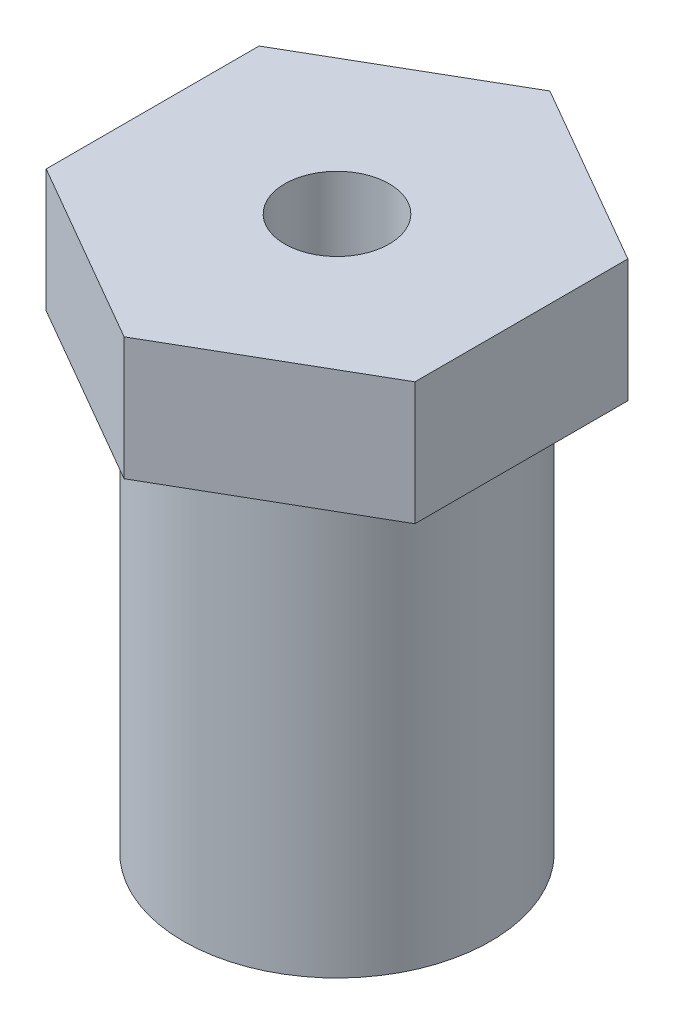
ISO-10303-21;
HEADER;
FILE_DESCRIPTION(('STEP AP214'),'2;1');
FILE_NAME('part.step','',(''),(''),'','','');
FILE_SCHEMA(('AUTOMOTIVE_DESIGN { 1 0 10303 214 1 1 1 1 }'));
ENDSEC;
DATA;
#1=APPLICATION_CONTEXT('core data for automotive mechanical design processes');
#2=APPLICATION_PROTOCOL_DEFINITION('international standard','automotive_design',2000,#1);
#3=PRODUCT_CONTEXT('',#1,'mechanical');
#4=PRODUCT('Part','Part','',(#3));
#5=PRODUCT_RELATED_PRODUCT_CATEGORY('part','',(#4));
#6=PRODUCT_DEFINITION_FORMATION('','',#4);
#7=PRODUCT_DEFINITION_CONTEXT('part definition',#1,'design');
#8=PRODUCT_DEFINITION('design','',#6,#7);
#9=PRODUCT_DEFINITION_SHAPE('','',#8);
#10=(LENGTH_UNIT() NAMED_UNIT(*) SI_UNIT(.MILLI.,.METRE.));
#11=(NAMED_UNIT(*) PLANE_ANGLE_UNIT() SI_UNIT($,.RADIAN.));
#12=(NAMED_UNIT(*) SI_UNIT($,.STERADIAN.) SOLID_ANGLE_UNIT());
#13=UNCERTAINTY_MEASURE_WITH_UNIT(LENGTH_MEASURE(1.E-05),#10,'distance_accuracy_value','');
#14=(GEOMETRIC_REPRESENTATION_CONTEXT(3) GLOBAL_UNCERTAINTY_ASSIGNED_CONTEXT((#13)) GLOBAL_UNIT_ASSIGNED_CONTEXT((#10,
#11,#12)) REPRESENTATION_CONTEXT('',''));
#15=CARTESIAN_POINT('',(0.,0.,0.));
#16=DIRECTION('',(0.,0.,1.));
#17=DIRECTION('',(1.,0.,0.));
#18=AXIS2_PLACEMENT_3D('',#15,#16,#17);
#19=CARTESIAN_POINT('',(-3.,6.,-5.19615242270664));
#20=DIRECTION('',(-0.5,0.,-0.866025403784438));
#21=DIRECTION('',(-0.866025403784439,0.,0.5));
#22=AXIS2_PLACEMENT_3D('',#19,#20,#21);
#23=CYLINDRICAL_SURFACE('',#22,1.69999999999999);
#24=CARTESIAN_POINT('',(0.,6.79999999999998,-3.));
#25=CARTESIAN_POINT('',(-0.05408169265973,6.88781961083474,-2.99999842011512));
#26=CARTESIAN_POINT('',(-0.11584986274738,6.97092265030721,-2.99853255813965));
#27=CARTESIAN_POINT('',(-0.251580183169669,7.12625088742073,-2.99020647210895));
#28=CARTESIAN_POINT('',(-0.325555140778262,7.19846450602118,-2.98334055355004));
#29=CARTESIAN_POINT('',(-0.482982376331943,7.33058608028531,-2.96193211334839));
#30=CARTESIAN_POINT('',(-0.56644430771567,7.39048132419887,-2.94738171651048));
#31=CARTESIAN_POINT('',(-0.739897877773428,7.49601278090847,-2.90868096501998));
#32=CARTESIAN_POINT('',(-0.829883890136409,7.5416611040453,-2.88453880357756));
#33=CARTESIAN_POINT('',(-1.00887962701823,7.6149604397967,-2.82676304946186));
#34=CARTESIAN_POINT('',(-1.09774410608916,7.64334225341772,-2.79361673714729));
#35=CARTESIAN_POINT('',(-1.27489957816332,7.68367031629994,-2.71733254736103));
#36=CARTESIAN_POINT('',(-1.36319104222212,7.6956324155236,-2.67420435248285));
#37=CARTESIAN_POINT('',(-1.5248859990315,7.7019614399458,-2.58499256321337));
#38=CARTESIAN_POINT('',(-1.59878255194164,7.69831671712663,-2.53992971618292));
#39=CARTESIAN_POINT('',(-1.74116848270436,7.67804128946428,-2.44451880767874));
#40=CARTESIAN_POINT('',(-1.80965816352961,7.66141131281595,-2.39417104271284));
#41=CARTESIAN_POINT('',(-1.93804307206996,7.61653585479174,-2.29141739960441));
#42=CARTESIAN_POINT('',(-1.99810829551771,7.58858622480206,-2.23909263634188));
#43=CARTESIAN_POINT('',(-2.11081351753923,7.52217046659896,-2.13317926024697));
#44=CARTESIAN_POINT('',(-2.16345193033774,7.48370209755677,-2.0795903803424));
#45=CARTESIAN_POINT('',(-2.26567953207534,7.39325492628011,-1.9679818983662));
#46=CARTESIAN_POINT('',(-2.31450655739578,7.340341035683,-1.91002388404943));
#47=CARTESIAN_POINT('',(-2.40314245716176,7.22447784736072,-1.79723761210463));
#48=CARTESIAN_POINT('',(-2.44294174111377,7.16151799724178,-1.74241272872222));
#49=CARTESIAN_POINT('',(-2.51798674739819,7.01879947622295,-1.63238218969293));
#50=CARTESIAN_POINT('',(-2.55216808185899,6.93793922894885,-1.57787065692512));
#51=CARTESIAN_POINT('',(-2.61024937587533,6.76646107669214,-1.47981572008613));
#52=CARTESIAN_POINT('',(-2.63415947316876,6.67585290393186,-1.43626151877994));
#53=CARTESIAN_POINT('',(-2.6684041815498,6.50521626410009,-1.37138485768083));
#54=CARTESIAN_POINT('',(-2.68047452737696,6.42655677976909,-1.34738620379777));
#55=CARTESIAN_POINT('',(-2.6982723487657,6.26587538127644,-1.31138832935055));
#56=CARTESIAN_POINT('',(-2.70400741191225,6.1838576116568,-1.29937475627676));
#57=CARTESIAN_POINT('',(-2.7091706920176,6.0184960092893,-1.28857865215158));
#58=CARTESIAN_POINT('',(-2.70858019415916,5.93514897049141,-1.28983538248938));
#59=CARTESIAN_POINT('',(-2.70104647521384,5.76998520070034,-1.30553343364534));
#60=CARTESIAN_POINT('',(-2.69410005791733,5.68816926077823,-1.31998138794386));
#61=CARTESIAN_POINT('',(-2.67421401115099,5.53134855143156,-1.35979577621028));
#62=CARTESIAN_POINT('',(-2.66150650325925,5.45620367579721,-1.3847368571845));
#63=CARTESIAN_POINT('',(-2.63010523926771,5.31081793839377,-1.44348611278553));
#64=CARTESIAN_POINT('',(-2.61140932149964,5.24057885866526,-1.47729748857125));
#65=CARTESIAN_POINT('',(-2.56480646862616,5.09648655712385,-1.55697753274693));
#66=CARTESIAN_POINT('',(-2.53597770764162,5.0234989025504,-1.60387068535018));
#67=CARTESIAN_POINT('',(-2.46992452567164,4.88600319753576,-1.70383892133012));
#68=CARTESIAN_POINT('',(-2.43269314476303,4.8215022471779,-1.75691911172994));
#69=CARTESIAN_POINT('',(-2.34377377735252,4.69388203930191,-1.87425823230111));
#70=CARTESIAN_POINT('',(-2.29081045598446,4.63213443732866,-1.93905728510565));
#71=CARTESIAN_POINT('',(-2.17321979261564,4.5226880254782,-2.069986734252));
#72=CARTESIAN_POINT('',(-2.10859568958922,4.4749853240572,-2.1361167563747));
#73=CARTESIAN_POINT('',(-1.97098953851385,4.39729840260364,-2.26354234621131));
#74=CARTESIAN_POINT('',(-1.8984553124316,4.36667144558871,-2.32492510802883));
#75=CARTESIAN_POINT('',(-1.74461579704232,4.32196888379412,-2.44246757305399));
#76=CARTESIAN_POINT('',(-1.66332054009747,4.30787456262987,-2.49863311612159));
#77=CARTESIAN_POINT('',(-1.50529060531348,4.29778908231391,-2.59646757662748));
#78=CARTESIAN_POINT('',(-1.42925746120449,4.29975398732385,-2.63907102471868));
#79=CARTESIAN_POINT('',(-1.27497936146063,4.31689698120534,-2.71696325524233));
#80=CARTESIAN_POINT('',(-1.1967345756648,4.33207405812473,-2.75225259762353));
#81=CARTESIAN_POINT('',(-1.04315970159673,4.37416835500948,-2.81397417775792));
#82=CARTESIAN_POINT('',(-0.967818867473064,4.40068032070097,-2.84066093632769));
#83=CARTESIAN_POINT('',(-0.819503870906033,4.46430590331753,-2.88694566956916));
#84=CARTESIAN_POINT('',(-0.746530173326471,4.5014215887577,-2.90654225943778));
#85=CARTESIAN_POINT('',(-0.598380708122485,4.58890626107131,-2.94078680808685));
#86=CARTESIAN_POINT('',(-0.523592864252902,4.64016439928516,-2.95483452376178));
#87=CARTESIAN_POINT('',(-0.380897858422043,4.75270872757631,-2.97659840220921));
#88=CARTESIAN_POINT('',(-0.31299769745678,4.81400495871614,-2.98430817819977));
#89=CARTESIAN_POINT('',(-0.178475553782575,4.95339298110832,-2.99553382772199));
#90=CARTESIAN_POINT('',(-0.11296805612401,5.03261553520194,-2.99844115570703));
#91=CARTESIAN_POINT('',(0.00395170643339162,5.2009106307356,-3.00056838201603));
#92=CARTESIAN_POINT('',(0.0553752348809439,5.28997522059763,-2.99979123613255));
#93=CARTESIAN_POINT('',(0.132870092929511,5.45905164296436,-2.99725987916219));
#94=CARTESIAN_POINT('',(0.161862463285092,5.53772397881135,-2.99571121709793));
#95=CARTESIAN_POINT('',(0.206280719317359,5.69878963935455,-2.99298401410815));
#96=CARTESIAN_POINT('',(0.221722993947297,5.78117834184618,-2.99180502717033));
#97=CARTESIAN_POINT('',(0.237833260595179,5.94772326187039,-2.99056976027155));
#98=CARTESIAN_POINT('',(0.238447907908849,6.03188477131879,-2.99051753407944));
#99=CARTESIAN_POINT('',(0.224707994913821,6.19897352067671,-2.99157964052133));
#100=CARTESIAN_POINT('',(0.210348528585427,6.28190034703134,-2.99269435548469));
#101=CARTESIAN_POINT('',(0.168941074284039,6.4400278492101,-2.99530546548334));
#102=CARTESIAN_POINT('',(0.142561406538309,6.51540759423706,-2.9967800597025));
#103=CARTESIAN_POINT('',(0.0789893740049566,6.66146584789714,-2.99912814947559));
#104=CARTESIAN_POINT('',(0.0417894041836181,6.73214100683732,-3.00000122079108));
#105=CARTESIAN_POINT('',(0.,6.79999999999998,-3.));
#106=B_SPLINE_CURVE_WITH_KNOTS('',3,(#24,#25,#26,#27,#28,#29,#30,#31,#32,#33,#34,#35,#36,#37,
#38,#39,#40,#41,#42,#43,#44,#45,#46,#47,#48,#49,#50,#51,#52,#53,#54,#55,#56,#57,#58,#59,#60,#61,
#62,#63,#64,#65,#66,#67,#68,#69,#70,#71,#72,#73,#74,#75,#76,#77,#78,#79,#80,#81,#82,#83,#84,#85,
#86,#87,#88,#89,#90,#91,#92,#93,#94,#95,#96,#97,#98,#99,#100,#101,#102,#103,#104,#105),
.UNSPECIFIED.,.T.,.F.,(4,2,2,2,2,2,2,2,2,2,2,2,2,2,2,2,2,2,2,2,2,2,2,2,2,2,2,2,2,2,2,2,2,2,2,2,
2,2,2,2,4),(0.,0.309103118637499,0.618532632506998,0.928279872558717,1.23776309584082,
1.53302093289259,1.82799355642621,2.08658144245674,2.3451548282823,2.59736634859509,
2.84963163996676,3.12581233294823,3.40228506265132,3.71084137226387,4.01909243233194,
4.26740108876914,4.51541202958213,4.76415693822371,5.01302700233424,5.25265587010564,
5.49237133565607,5.76557012074642,6.03899603344368,6.34947380416687,6.65986546695699,
6.9576104158414,7.25501796517906,7.51522377722609,7.77540966123482,8.02698283348582,
8.27860511479093,8.55275851048861,8.82718783481127,9.13428758585227,9.44114101420879,
9.69166512924072,9.94188581393857,10.1930065728861,10.4442096332381,10.6828881960336,
10.9217349207548),.UNSPECIFIED.);
#107=CARTESIAN_POINT('',(0.,6.79999999999998,-3.));
#108=VERTEX_POINT('',#107);
#109=EDGE_CURVE('E191',#108,#108,#106,.T.);
#110=ORIENTED_EDGE('',*,*,#109,.T.);
#111=EDGE_LOOP('',(#110));
#112=FACE_BOUND('',#111,.T.);
#113=CARTESIAN_POINT('',(-2.5,6.,-4.3301270189222));
#114=DIRECTION('',(-0.5,0.,-0.866025403784438));
#115=DIRECTION('',(-0.866025403784438,0.,0.5));
#116=AXIS2_PLACEMENT_3D('',#113,#114,#115);
#117=CIRCLE('',#116,1.69999999999999);
#118=CARTESIAN_POINT('',(-3.97224318643354,6.,-3.4801270189222));
#119=VERTEX_POINT('',#118);
#120=EDGE_CURVE('E359',#119,#119,#117,.F.);
#121=ORIENTED_EDGE('',*,*,#120,.F.);
#122=EDGE_LOOP('',(#121));
#123=FACE_BOUND('',#122,.T.);
#124=ADVANCED_FACE('F35',(#112,#123),#23,.F.);
#125=CARTESIAN_POINT('',(4.5006830127019,6.,7.79541164676185));
#126=DIRECTION('',(-0.5,0.,-0.866025403784438));
#127=DIRECTION('',(-0.866025403784439,0.,0.5));
#128=AXIS2_PLACEMENT_3D('',#125,#126,#127);
#129=CYLINDRICAL_SURFACE('',#128,2.5493621783471);
#130=CARTESIAN_POINT('',(-4.35843746343336,6.,-2.45031077158401));
#131=CARTESIAN_POINT('',(-4.35843474018136,6.13242592835763,-2.45032826808866));
#132=CARTESIAN_POINT('',(-4.35254571689391,6.26501521387592,-2.46088318635183));
#133=CARTESIAN_POINT('',(-4.3290047454725,6.5260879254046,-2.50204754187415));
#134=CARTESIAN_POINT('',(-4.31132906271113,6.65456251753066,-2.53269744201476));
#135=CARTESIAN_POINT('',(-4.26437981041503,6.90313592021332,-2.61096055717455));
#136=CARTESIAN_POINT('',(-4.23516979816396,7.02327645848354,-2.65848067025964));
#137=CARTESIAN_POINT('',(-4.1650929988781,7.25358987936444,-2.76697644766752));
#138=CARTESIAN_POINT('',(-4.12422519082727,7.36376188779507,-2.8279532904551));
#139=CARTESIAN_POINT('',(-4.02657949662629,7.58146147598714,-2.96552832104463));
#140=CARTESIAN_POINT('',(-3.96873595591368,7.68794766276453,-3.04301875519778));
#141=CARTESIAN_POINT('',(-3.83866690142188,7.8853238227186,-3.20553792859178));
#142=CARTESIAN_POINT('',(-3.76643400570172,7.97620574594729,-3.29057052459471));
#143=CARTESIAN_POINT('',(-3.60177665440593,8.14609788539377,-3.47031239521371));
#144=CARTESIAN_POINT('',(-3.508284851063,8.22381236694947,-3.56528057340904));
#145=CARTESIAN_POINT('',(-3.30526791451359,8.35605154263622,-3.75424801663677));
#146=CARTESIAN_POINT('',(-3.19575335964838,8.41059144475398,-3.84824787746577));
#147=CARTESIAN_POINT('',(-2.97137567063272,8.49075963192941,-4.02364117242568));
#148=CARTESIAN_POINT('',(-2.85749734597724,8.51821834491896,-4.10545336455949));
#149=CARTESIAN_POINT('',(-2.62093520639103,8.54948765515492,-4.26035662772273));
#150=CARTESIAN_POINT('',(-2.498257015185,8.55331322178932,-4.33345319050352));
#151=CARTESIAN_POINT('',(-2.25966278054755,8.53787982490927,-4.46213407461893));
#152=CARTESIAN_POINT('',(-2.14413709987689,8.52067515398633,-4.51870389883828));
#153=CARTESIAN_POINT('',(-1.91282113769791,8.46736669165771,-4.62137760300195));
#154=CARTESIAN_POINT('',(-1.79703083696716,8.43126148083563,-4.66748069652977));
#155=CARTESIAN_POINT('',(-1.56706760050104,8.34098207385927,-4.74967624045102));
#156=CARTESIAN_POINT('',(-1.45293699688411,8.28657271447384,-4.78562658432226));
#157=CARTESIAN_POINT('',(-1.23100702865721,8.1615751811913,-4.84746453339607));
#158=CARTESIAN_POINT('',(-1.12320991413972,8.09098130057776,-4.87334858048785));
#159=CARTESIAN_POINT('',(-0.906659690568706,7.92774404988494,-4.91847117400741));
#160=CARTESIAN_POINT('',(-0.798833314420978,7.83362392760335,-4.93681852560103));
#161=CARTESIAN_POINT('',(-0.597501973262954,7.62993839045092,-4.96521398389935));
#162=CARTESIAN_POINT('',(-0.50400880089441,7.52036039842528,-4.9752552863403));
#163=CARTESIAN_POINT('',(-0.329217340193053,7.27978167968964,-4.98997266328497));
#164=CARTESIAN_POINT('',(-0.249179896839478,7.14783108411252,-4.99423766575049));
#165=CARTESIAN_POINT('',(-0.114433323471274,6.87152113433902,-4.99914941394098));
#166=CARTESIAN_POINT('',(-0.0596969641099141,6.72717531942434,-4.9998000578353));
#167=CARTESIAN_POINT('',(0.0168055637891447,6.44229734119767,-5.00010827943268));
#168=CARTESIAN_POINT('',(0.0408618940561221,6.30238617850803,-4.99984124330395));
#169=CARTESIAN_POINT('',(0.061614730456127,6.02058812721735,-4.99963366800008));
#170=CARTESIAN_POINT('',(0.0583324240379804,5.87870285368028,-4.99969287597365));
#171=CARTESIAN_POINT('',(0.0267530582802505,5.61455469511559,-4.99994591571752));
#172=CARTESIAN_POINT('',(0.00140079561449291,5.49192426374894,-5.00012334064891));
#173=CARTESIAN_POINT('',(-0.068626119677459,5.25232668651963,-4.99965069481582));
#174=CARTESIAN_POINT('',(-0.113307363467762,5.13536148763809,-4.99900034163272));
#175=CARTESIAN_POINT('',(-0.222002207433863,4.90427155618175,-4.99537667042951));
#176=CARTESIAN_POINT('',(-0.286810425681824,4.7905248719053,-4.99229789073031));
#177=CARTESIAN_POINT('',(-0.431988936743663,4.57365709897623,-4.9818350277141));
#178=CARTESIAN_POINT('',(-0.51236724412999,4.47054152466295,-4.97444872318109));
#179=CARTESIAN_POINT('',(-0.69745418830475,4.26360365632202,-4.95210464042128));
#180=CARTESIAN_POINT('',(-0.803974279151221,4.16148785951105,-4.9362754701477));
#181=CARTESIAN_POINT('',(-1.02977465854472,3.97494960903647,-4.89415508221757));
#182=CARTESIAN_POINT('',(-1.14905979000597,3.89053390679263,-4.86785988350439));
#183=CARTESIAN_POINT('',(-1.40031760692858,3.73956011764782,-4.80171552553947));
#184=CARTESIAN_POINT('',(-1.53256632220991,3.67362531954706,-4.7614773776739));
#185=CARTESIAN_POINT('',(-1.80156631559727,3.56601410379657,-4.66633041008536));
#186=CARTESIAN_POINT('',(-1.93831336708179,3.52431556500349,-4.61143503545447));
#187=CARTESIAN_POINT('',(-2.19794552418598,3.47008458744953,-4.49304497853895));
#188=CARTESIAN_POINT('',(-2.32092533345073,3.45517894339486,-4.43084372234883));
#189=CARTESIAN_POINT('',(-2.56175475106549,3.44788273191579,-4.29609361061714));
#190=CARTESIAN_POINT('',(-2.6796062895383,3.45548361804209,-4.2235486928529));
#191=CARTESIAN_POINT('',(-2.89845805694549,3.49145075216617,-4.07616724358668));
#192=CARTESIAN_POINT('',(-3.00006048010486,3.51832113375102,-4.00184947660826));
#193=CARTESIAN_POINT('',(-3.19347436338754,3.58999420262173,-3.84927312756091));
#194=CARTESIAN_POINT('',(-3.28528446897587,3.63479936669591,-3.77101400249702));
#195=CARTESIAN_POINT('',(-3.46142306098998,3.74297774102967,-3.61017573080965));
#196=CARTESIAN_POINT('',(-3.54528232980237,3.80704495954281,-3.52755217311567));
#197=CARTESIAN_POINT('',(-3.70046397569924,3.95106352218964,-3.36441129880491));
#198=CARTESIAN_POINT('',(-3.77178062380621,4.03102208953492,-3.28389495890085));
#199=CARTESIAN_POINT('',(-3.90857223852594,4.2140842630159,-3.1201887506843));
#200=CARTESIAN_POINT('',(-3.97269093029188,4.31872287125662,-3.03757634063891));
#201=CARTESIAN_POINT('',(-4.08604752618703,4.54319552239309,-2.88329644292488));
#202=CARTESIAN_POINT('',(-4.13527135592535,4.66304378632809,-2.81163933852671));
#203=CARTESIAN_POINT('',(-4.22072311908496,4.92062689847625,-2.68175372708998));
#204=CARTESIAN_POINT('',(-4.25638926030063,5.05886672872528,-2.6241354492129));
#205=CARTESIAN_POINT('',(-4.29810199527818,5.27364798589101,-2.55480591124155));
#206=CARTESIAN_POINT('',(-4.31003639808117,5.34641017844248,-2.5345562184029));
#207=CARTESIAN_POINT('',(-4.33001368128678,5.49389018875048,-2.50027591637198));
#208=CARTESIAN_POINT('',(-4.33805924318102,5.5686066214101,-2.48624102242057));
#209=CARTESIAN_POINT('',(-4.3489138405607,5.70277321144238,-2.46719276618697));
#210=CARTESIAN_POINT('',(-4.35248405865753,5.76198058953385,-2.46087638550313));
#211=CARTESIAN_POINT('',(-4.35724656224872,5.88078092214493,-2.4524313099679));
#212=CARTESIAN_POINT('',(-4.35843868960479,5.94037390204194,-2.4503028936079));
#213=CARTESIAN_POINT('',(-4.35843746343336,6.,-2.45031077158401));
#214=B_SPLINE_CURVE_WITH_KNOTS('',3,(#130,#131,#132,#133,#134,#135,#136,#137,#138,#139,#140,
#141,#142,#143,#144,#145,#146,#147,#148,#149,#150,#151,#152,#153,#154,#155,#156,#157,#158,#159,
#160,#161,#162,#163,#164,#165,#166,#167,#168,#169,#170,#171,#172,#173,#174,#175,#176,#177,#178,
#179,#180,#181,#182,#183,#184,#185,#186,#187,#188,#189,#190,#191,#192,#193,#194,#195,#196,#197,
#198,#199,#200,#201,#202,#203,#204,#205,#206,#207,#208,#209,#210,#211,#212,#213),.UNSPECIFIED.,
.T.,.F.,(4,2,2,2,2,2,2,2,2,2,2,2,2,2,2,2,2,2,2,2,2,2,2,2,2,2,2,2,2,2,2,2,2,2,2,2,2,2,2,2,2,4),
(0.,0.397036179111605,0.794874288400811,1.19055012586621,1.58626062815893,2.01598646991388,
2.44593333743397,2.90631452459125,3.36639312482059,3.79265457690301,4.21864600451408,
4.60615226712096,4.99368763533404,5.38640514339148,5.77926133851125,6.21032683141178,
6.64174510174315,7.10248735089337,7.56273258224711,7.9861038316588,8.40914699881666,
8.78313490643325,9.15725044422007,9.54857222927018,9.94009598175743,10.3833465995609,
10.8267659819339,11.2837116564872,11.7402396057355,12.1538530676552,12.5673094874606,
12.9517283789422,13.3362003768881,13.7366435004784,14.1372690584275,14.5791196874475,
15.0213865336425,15.4803767371496,15.7094618606165,15.9383887957455,16.117146417492,
16.2959159258671),.UNSPECIFIED.);
#215=CARTESIAN_POINT('',(-2.50000000000001,8.5493621783471,-4.3301270189222));
#216=VERTEX_POINT('',#215);
#217=CARTESIAN_POINT('',(-2.5,3.4506378216529,-4.33012701892219));
#218=VERTEX_POINT('',#217);
#219=EDGE_CURVE('E198',#216,#218,#214,.T.);
#220=ORIENTED_EDGE('',*,*,#219,.T.);
#221=CARTESIAN_POINT('',(-2.5,6.,-4.3301270189222));
#222=DIRECTION('',(-0.5,0.,-0.866025403784438));
#223=DIRECTION('',(-0.866025403784438,0.,0.5));
#224=AXIS2_PLACEMENT_3D('',#221,#222,#223);
#225=CIRCLE('',#224,2.5493621783471);
#226=EDGE_CURVE('E49',#216,#218,#225,.T.);
#227=ORIENTED_EDGE('',*,*,#226,.F.);
#228=EDGE_LOOP('',(#220,#227));
#229=FACE_BOUND('',#228,.T.);
#230=ADVANCED_FACE('F171',(#229),#129,.T.);
#231=EDGE_CURVE('E360',#218,#216,#214,.T.);
#232=ORIENTED_EDGE('',*,*,#231,.T.);
#233=EDGE_CURVE('E362',#218,#216,#225,.T.);
#234=ORIENTED_EDGE('',*,*,#233,.F.);
#235=EDGE_LOOP('',(#232,#234));
#236=FACE_BOUND('',#235,.T.);
#237=ADVANCED_FACE('F164',(#236),#129,.T.);
#238=CARTESIAN_POINT('',(0.,0.,0.));
#239=DIRECTION('',(0.,1.,0.));
#240=DIRECTION('',(0.,0.,1.));
#241=AXIS2_PLACEMENT_3D('',#238,#239,#240);
#242=PLANE('',#241);
#243=CARTESIAN_POINT('',(0.,0.,0.));
#244=DIRECTION('',(0.,1.,0.));
#245=DIRECTION('',(0.,0.,1.));
#246=AXIS2_PLACEMENT_3D('',#243,#244,#245);
#247=CIRCLE('',#246,5.);
#248=CARTESIAN_POINT('',(0.,0.,5.));
#249=VERTEX_POINT('',#248);
#250=EDGE_CURVE('E39',#249,#249,#247,.T.);
#251=ORIENTED_EDGE('',*,*,#250,.F.);
#252=EDGE_LOOP('',(#251));
#253=FACE_BOUND('',#252,.T.);
#254=CARTESIAN_POINT('',(0.,0.,0.));
#255=DIRECTION('',(0.,1.,0.));
#256=DIRECTION('',(0.,0.,1.));
#257=AXIS2_PLACEMENT_3D('',#254,#255,#256);
#258=CIRCLE('',#257,3.);
#259=CARTESIAN_POINT('',(0.,0.,3.));
#260=VERTEX_POINT('',#259);
#261=EDGE_CURVE('E154',#260,#260,#258,.T.);
#262=ORIENTED_EDGE('',*,*,#261,.T.);
#263=EDGE_LOOP('',(#262));
#264=FACE_BOUND('',#263,.T.);
#265=ADVANCED_FACE('F162',(#253,#264),#242,.F.);
#266=CARTESIAN_POINT('',(0.,14.,0.));
#267=DIRECTION('',(0.,-1.,0.));
#268=DIRECTION('',(0.,0.,-1.));
#269=AXIS2_PLACEMENT_3D('',#266,#267,#268);
#270=CYLINDRICAL_SURFACE('',#269,5.);
#271=ORIENTED_EDGE('',*,*,#219,.F.);
#272=ORIENTED_EDGE('',*,*,#231,.F.);
#273=EDGE_LOOP('',(#271,#272));
#274=FACE_BOUND('',#273,.T.);
#275=CARTESIAN_POINT('',(0.,14.,0.));
#276=DIRECTION('',(0.,1.,0.));
#277=DIRECTION('',(0.,0.,1.));
#278=AXIS2_PLACEMENT_3D('',#275,#276,#277);
#279=CIRCLE('',#278,5.);
#280=CARTESIAN_POINT('',(0.,14.,5.));
#281=VERTEX_POINT('',#280);
#282=EDGE_CURVE('E11',#281,#281,#279,.T.);
#283=ORIENTED_EDGE('',*,*,#282,.F.);
#284=EDGE_LOOP('',(#283));
#285=FACE_BOUND('',#284,.T.);
#286=ORIENTED_EDGE('',*,*,#250,.T.);
#287=EDGE_LOOP('',(#286));
#288=FACE_BOUND('',#287,.T.);
#289=ADVANCED_FACE('F37',(#274,#285,#288),#270,.T.);
#290=CARTESIAN_POINT('',(0.,14.,0.));
#291=DIRECTION('',(0.,-1.,0.));
#292=DIRECTION('',(0.,0.,-1.));
#293=AXIS2_PLACEMENT_3D('',#290,#291,#292);
#294=CYLINDRICAL_SURFACE('',#293,3.);
#295=ORIENTED_EDGE('',*,*,#109,.F.);
#296=EDGE_LOOP('',(#295));
#297=FACE_BOUND('',#296,.T.);
#298=CARTESIAN_POINT('',(0.,14.,0.));
#299=DIRECTION('',(0.,1.,0.));
#300=DIRECTION('',(0.,0.,1.));
#301=AXIS2_PLACEMENT_3D('',#298,#299,#300);
#302=CIRCLE('',#301,3.);
#303=CARTESIAN_POINT('',(0.,14.,3.));
#304=VERTEX_POINT('',#303);
#305=EDGE_CURVE('E151',#304,#304,#302,.T.);
#306=ORIENTED_EDGE('',*,*,#305,.T.);
#307=EDGE_LOOP('',(#306));
#308=FACE_BOUND('',#307,.T.);
#309=ORIENTED_EDGE('',*,*,#261,.F.);
#310=EDGE_LOOP('',(#309));
#311=FACE_BOUND('',#310,.T.);
#312=ADVANCED_FACE('F169',(#297,#308,#311),#294,.F.);
#313=CARTESIAN_POINT('',(0.,14.,0.));
#314=DIRECTION('',(0.,1.,0.));
#315=DIRECTION('',(0.,0.,1.));
#316=AXIS2_PLACEMENT_3D('',#313,#314,#315);
#317=PLANE('',#316);
#318=CARTESIAN_POINT('',(0.,14.,0.));
#319=DIRECTION('',(0.,1.,0.));
#320=DIRECTION('',(0.,0.,1.));
#321=AXIS2_PLACEMENT_3D('',#318,#319,#320);
#322=CIRCLE('',#321,1.69999999999999);
#323=CARTESIAN_POINT('',(0.,14.,1.69999999999999));
#324=VERTEX_POINT('',#323);
#325=EDGE_CURVE('E134',#324,#324,#322,.T.);
#326=ORIENTED_EDGE('',*,*,#325,.T.);
#327=EDGE_LOOP('',(#326));
#328=FACE_BOUND('',#327,.T.);
#329=ORIENTED_EDGE('',*,*,#305,.F.);
#330=EDGE_LOOP('',(#329));
#331=FACE_BOUND('',#330,.T.);
#332=ADVANCED_FACE('F221',(#328,#331),#317,.F.);
#333=CARTESIAN_POINT('',(6.,18.,-3.46410161513776));
#334=DIRECTION('',(-0.5,0.,0.866025403784439));
#335=DIRECTION('',(0.866025403784439,0.,0.5));
#336=AXIS2_PLACEMENT_3D('',#333,#334,#335);
#337=PLANE('',#336);
#338=DIRECTION('',(-0.866025403784439,0.,-0.5));
#339=VECTOR('',#338,1.);
#340=CARTESIAN_POINT('',(6.,14.,-3.46410161513776));
#341=LINE('',#340,#339);
#342=CARTESIAN_POINT('',(6.,14.,-3.46410161513776));
#343=VERTEX_POINT('',#342);
#344=CARTESIAN_POINT('',(0.,14.,-6.92820323027551));
#345=VERTEX_POINT('',#344);
#346=EDGE_CURVE('E130',#343,#345,#341,.T.);
#347=ORIENTED_EDGE('',*,*,#346,.T.);
#348=DIRECTION('',(0.,-1.,0.));
#349=VECTOR('',#348,1.);
#350=CARTESIAN_POINT('',(0.,18.,-6.92820323027551));
#351=LINE('',#350,#349);
#352=CARTESIAN_POINT('',(0.,18.,-6.92820323027551));
#353=VERTEX_POINT('',#352);
#354=EDGE_CURVE('E149',#353,#345,#351,.T.);
#355=ORIENTED_EDGE('',*,*,#354,.F.);
#356=DIRECTION('',(-0.866025403784439,0.,-0.5));
#357=VECTOR('',#356,1.);
#358=CARTESIAN_POINT('',(6.,18.,-3.46410161513776));
#359=LINE('',#358,#357);
#360=CARTESIAN_POINT('',(6.,18.,-3.46410161513776));
#361=VERTEX_POINT('',#360);
#362=EDGE_CURVE('E142',#361,#353,#359,.T.);
#363=ORIENTED_EDGE('',*,*,#362,.F.);
#364=DIRECTION('',(0.,-1.,0.));
#365=VECTOR('',#364,1.);
#366=CARTESIAN_POINT('',(6.,18.,-3.46410161513776));
#367=LINE('',#366,#365);
#368=EDGE_CURVE('E126',#361,#343,#367,.T.);
#369=ORIENTED_EDGE('',*,*,#368,.T.);
#370=EDGE_LOOP('',(#347,#355,#363,#369));
#371=FACE_BOUND('',#370,.T.);
#372=ADVANCED_FACE('F219',(#371),#337,.F.);
#373=CARTESIAN_POINT('',(0.,18.,-6.92820323027551));
#374=DIRECTION('',(0.5,0.,0.866025403784439));
#375=DIRECTION('',(0.866025403784438,0.,-0.5));
#376=AXIS2_PLACEMENT_3D('',#373,#374,#375);
#377=PLANE('',#376);
#378=DIRECTION('',(-0.866025403784438,0.,0.5));
#379=VECTOR('',#378,1.);
#380=CARTESIAN_POINT('',(0.,14.,-6.92820323027551));
#381=LINE('',#380,#379);
#382=CARTESIAN_POINT('',(-6.,14.,-3.46410161513775));
#383=VERTEX_POINT('',#382);
#384=EDGE_CURVE('E133',#345,#383,#381,.T.);
#385=ORIENTED_EDGE('',*,*,#384,.T.);
#386=DIRECTION('',(0.,-1.,0.));
#387=VECTOR('',#386,1.);
#388=CARTESIAN_POINT('',(-6.,18.,-3.46410161513775));
#389=LINE('',#388,#387);
#390=CARTESIAN_POINT('',(-6.,18.,-3.46410161513775));
#391=VERTEX_POINT('',#390);
#392=EDGE_CURVE('E146',#391,#383,#389,.T.);
#393=ORIENTED_EDGE('',*,*,#392,.F.);
#394=DIRECTION('',(-0.866025403784438,0.,0.5));
#395=VECTOR('',#394,1.);
#396=CARTESIAN_POINT('',(0.,18.,-6.92820323027551));
#397=LINE('',#396,#395);
#398=EDGE_CURVE('E94',#353,#391,#397,.T.);
#399=ORIENTED_EDGE('',*,*,#398,.F.);
#400=ORIENTED_EDGE('',*,*,#354,.T.);
#401=EDGE_LOOP('',(#385,#393,#399,#400));
#402=FACE_BOUND('',#401,.T.);
#403=ADVANCED_FACE('F210',(#402),#377,.F.);
#404=CARTESIAN_POINT('',(-6.,18.,-3.46410161513775));
#405=DIRECTION('',(1.,0.,0.));
#406=DIRECTION('',(0.,0.,-1.));
#407=AXIS2_PLACEMENT_3D('',#404,#405,#406);
#408=PLANE('',#407);
#409=DIRECTION('',(0.,0.,1.));
#410=VECTOR('',#409,1.);
#411=CARTESIAN_POINT('',(-6.,14.,-3.46410161513775));
#412=LINE('',#411,#410);
#413=CARTESIAN_POINT('',(-6.,14.,3.46410161513776));
#414=VERTEX_POINT('',#413);
#415=EDGE_CURVE('E136',#383,#414,#412,.T.);
#416=ORIENTED_EDGE('',*,*,#415,.T.);
#417=DIRECTION('',(0.,-1.,0.));
#418=VECTOR('',#417,1.);
#419=CARTESIAN_POINT('',(-6.,18.,3.46410161513776));
#420=LINE('',#419,#418);
#421=CARTESIAN_POINT('',(-6.,18.,3.46410161513776));
#422=VERTEX_POINT('',#421);
#423=EDGE_CURVE('E121',#422,#414,#420,.T.);
#424=ORIENTED_EDGE('',*,*,#423,.F.);
#425=DIRECTION('',(0.,0.,1.));
#426=VECTOR('',#425,1.);
#427=CARTESIAN_POINT('',(-6.,18.,-3.46410161513775));
#428=LINE('',#427,#426);
#429=EDGE_CURVE('E109',#391,#422,#428,.T.);
#430=ORIENTED_EDGE('',*,*,#429,.F.);
#431=ORIENTED_EDGE('',*,*,#392,.T.);
#432=EDGE_LOOP('',(#416,#424,#430,#431));
#433=FACE_BOUND('',#432,.T.);
#434=ADVANCED_FACE('F213',(#433),#408,.F.);
#435=CARTESIAN_POINT('',(-6.,18.,3.46410161513776));
#436=DIRECTION('',(0.5,0.,-0.866025403784439));
#437=DIRECTION('',(-0.866025403784439,0.,-0.5));
#438=AXIS2_PLACEMENT_3D('',#435,#436,#437);
#439=PLANE('',#438);
#440=DIRECTION('',(0.866025403784439,0.,0.5));
#441=VECTOR('',#440,1.);
#442=CARTESIAN_POINT('',(-6.,14.,3.46410161513776));
#443=LINE('',#442,#441);
#444=CARTESIAN_POINT('',(0.,14.,6.92820323027551));
#445=VERTEX_POINT('',#444);
#446=EDGE_CURVE('E118',#414,#445,#443,.T.);
#447=ORIENTED_EDGE('',*,*,#446,.T.);
#448=DIRECTION('',(0.,-1.,0.));
#449=VECTOR('',#448,1.);
#450=CARTESIAN_POINT('',(0.,18.,6.92820323027551));
#451=LINE('',#450,#449);
#452=CARTESIAN_POINT('',(0.,18.,6.92820323027551));
#453=VERTEX_POINT('',#452);
#454=EDGE_CURVE('E115',#453,#445,#451,.T.);
#455=ORIENTED_EDGE('',*,*,#454,.F.);
#456=DIRECTION('',(0.866025403784439,0.,0.5));
#457=VECTOR('',#456,1.);
#458=CARTESIAN_POINT('',(-6.,18.,3.46410161513776));
#459=LINE('',#458,#457);
#460=EDGE_CURVE('E102',#422,#453,#459,.T.);
#461=ORIENTED_EDGE('',*,*,#460,.F.);
#462=ORIENTED_EDGE('',*,*,#423,.T.);
#463=EDGE_LOOP('',(#447,#455,#461,#462));
#464=FACE_BOUND('',#463,.T.);
#465=ADVANCED_FACE('F116',(#464),#439,.F.);
#466=CARTESIAN_POINT('',(0.,18.,6.92820323027551));
#467=DIRECTION('',(-0.5,0.,-0.866025403784439));
#468=DIRECTION('',(-0.866025403784439,0.,0.5));
#469=AXIS2_PLACEMENT_3D('',#466,#467,#468);
#470=PLANE('',#469);
#471=DIRECTION('',(0.866025403784439,0.,-0.5));
#472=VECTOR('',#471,1.);
#473=CARTESIAN_POINT('',(0.,14.,6.92820323027551));
#474=LINE('',#473,#472);
#475=CARTESIAN_POINT('',(6.,14.,3.46410161513775));
#476=VERTEX_POINT('',#475);
#477=EDGE_CURVE('E139',#445,#476,#474,.T.);
#478=ORIENTED_EDGE('',*,*,#477,.T.);
#479=DIRECTION('',(0.,-1.,0.));
#480=VECTOR('',#479,1.);
#481=CARTESIAN_POINT('',(6.,18.,3.46410161513775));
#482=LINE('',#481,#480);
#483=CARTESIAN_POINT('',(6.,18.,3.46410161513775));
#484=VERTEX_POINT('',#483);
#485=EDGE_CURVE('E122',#484,#476,#482,.T.);
#486=ORIENTED_EDGE('',*,*,#485,.F.);
#487=DIRECTION('',(0.866025403784439,0.,-0.5));
#488=VECTOR('',#487,1.);
#489=CARTESIAN_POINT('',(0.,18.,6.92820323027551));
#490=LINE('',#489,#488);
#491=EDGE_CURVE('E106',#453,#484,#490,.T.);
#492=ORIENTED_EDGE('',*,*,#491,.F.);
#493=ORIENTED_EDGE('',*,*,#454,.T.);
#494=EDGE_LOOP('',(#478,#486,#492,#493));
#495=FACE_BOUND('',#494,.T.);
#496=ADVANCED_FACE('F124',(#495),#470,.F.);
#497=CARTESIAN_POINT('',(6.,18.,3.46410161513775));
#498=DIRECTION('',(-1.,0.,0.));
#499=DIRECTION('',(0.,0.,1.));
#500=AXIS2_PLACEMENT_3D('',#497,#498,#499);
#501=PLANE('',#500);
#502=DIRECTION('',(0.,0.,-1.));
#503=VECTOR('',#502,1.);
#504=CARTESIAN_POINT('',(6.,14.,3.46410161513775));
#505=LINE('',#504,#503);
#506=EDGE_CURVE('E85',#476,#343,#505,.T.);
#507=ORIENTED_EDGE('',*,*,#506,.T.);
#508=ORIENTED_EDGE('',*,*,#368,.F.);
#509=DIRECTION('',(0.,0.,-1.));
#510=VECTOR('',#509,1.);
#511=CARTESIAN_POINT('',(6.,18.,3.46410161513775));
#512=LINE('',#511,#510);
#513=EDGE_CURVE('E58',#484,#361,#512,.T.);
#514=ORIENTED_EDGE('',*,*,#513,.F.);
#515=ORIENTED_EDGE('',*,*,#485,.T.);
#516=EDGE_LOOP('',(#507,#508,#514,#515));
#517=FACE_BOUND('',#516,.T.);
#518=ADVANCED_FACE('F217',(#517),#501,.F.);
#519=CARTESIAN_POINT('',(0.,18.,0.));
#520=DIRECTION('',(0.,1.,0.));
#521=DIRECTION('',(0.,0.,1.));
#522=AXIS2_PLACEMENT_3D('',#519,#520,#521);
#523=PLANE('',#522);
#524=CARTESIAN_POINT('',(0.,18.,0.));
#525=DIRECTION('',(0.,1.,0.));
#526=DIRECTION('',(0.,0.,1.));
#527=AXIS2_PLACEMENT_3D('',#524,#525,#526);
#528=CIRCLE('',#527,1.69999999999999);
#529=CARTESIAN_POINT('',(0.,18.,1.69999999999999));
#530=VERTEX_POINT('',#529);
#531=EDGE_CURVE('E197',#530,#530,#528,.T.);
#532=ORIENTED_EDGE('',*,*,#531,.F.);
#533=EDGE_LOOP('',(#532));
#534=FACE_BOUND('',#533,.T.);
#535=ORIENTED_EDGE('',*,*,#362,.T.);
#536=ORIENTED_EDGE('',*,*,#398,.T.);
#537=ORIENTED_EDGE('',*,*,#429,.T.);
#538=ORIENTED_EDGE('',*,*,#460,.T.);
#539=ORIENTED_EDGE('',*,*,#491,.T.);
#540=ORIENTED_EDGE('',*,*,#513,.T.);
#541=EDGE_LOOP('',(#535,#536,#537,#538,#539,#540));
#542=FACE_BOUND('',#541,.T.);
#543=ADVANCED_FACE('F104',(#534,#542),#523,.T.);
#544=ORIENTED_EDGE('',*,*,#282,.T.);
#545=EDGE_LOOP('',(#544));
#546=FACE_BOUND('',#545,.T.);
#547=ORIENTED_EDGE('',*,*,#346,.F.);
#548=ORIENTED_EDGE('',*,*,#506,.F.);
#549=ORIENTED_EDGE('',*,*,#477,.F.);
#550=ORIENTED_EDGE('',*,*,#446,.F.);
#551=ORIENTED_EDGE('',*,*,#415,.F.);
#552=ORIENTED_EDGE('',*,*,#384,.F.);
#553=EDGE_LOOP('',(#547,#548,#549,#550,#551,#552));
#554=FACE_BOUND('',#553,.T.);
#555=ADVANCED_FACE('F216',(#546,#554),#317,.F.);
#556=CARTESIAN_POINT('',(0.,18.,0.));
#557=DIRECTION('',(0.,1.,0.));
#558=DIRECTION('',(0.,0.,1.));
#559=AXIS2_PLACEMENT_3D('',#556,#557,#558);
#560=CYLINDRICAL_SURFACE('',#559,1.69999999999999);
#561=ORIENTED_EDGE('',*,*,#325,.F.);
#562=EDGE_LOOP('',(#561));
#563=FACE_BOUND('',#562,.T.);
#564=ORIENTED_EDGE('',*,*,#531,.T.);
#565=EDGE_LOOP('',(#564));
#566=FACE_BOUND('',#565,.T.);
#567=ADVANCED_FACE('F268',(#563,#566),#560,.F.);
#568=CARTESIAN_POINT('',(-2.5,6.,-4.3301270189222));
#569=DIRECTION('',(-0.5,0.,-0.866025403784438));
#570=DIRECTION('',(-0.866025403784438,0.,0.5));
#571=AXIS2_PLACEMENT_3D('',#568,#569,#570);
#572=PLANE('',#571);
#573=ORIENTED_EDGE('',*,*,#226,.T.);
#574=ORIENTED_EDGE('',*,*,#233,.T.);
#575=EDGE_LOOP('',(#573,#574));
#576=FACE_BOUND('',#575,.T.);
#577=ORIENTED_EDGE('',*,*,#120,.T.);
#578=EDGE_LOOP('',(#577));
#579=FACE_BOUND('',#578,.T.);
#580=ADVANCED_FACE('F272',(#576,#579),#572,.T.);
#581=CLOSED_SHELL('',(#124,#230,#237,#265,#289,#312,#332,#372,#403,#434,#465,#496,#518,#543,
#555,#567,#580));
#582=MANIFOLD_SOLID_BREP('B2',#581);
#583=ADVANCED_BREP_SHAPE_REPRESENTATION('',(#18,#582),#14);
#584=SHAPE_DEFINITION_REPRESENTATION(#9,#583);
ENDSEC;
END-ISO-10303-21;
